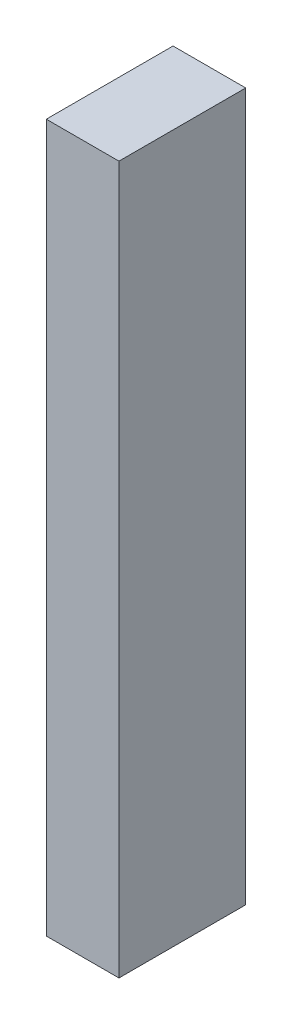
ISO-10303-21;
HEADER;
FILE_DESCRIPTION(('STEP AP214'),'2;1');
FILE_NAME('part.step','',(''),(''),'','','');
FILE_SCHEMA(('AUTOMOTIVE_DESIGN { 1 0 10303 214 1 1 1 1 }'));
ENDSEC;
DATA;
#1=APPLICATION_CONTEXT('core data for automotive mechanical design processes');
#2=APPLICATION_PROTOCOL_DEFINITION('international standard','automotive_design',2000,#1);
#3=PRODUCT_CONTEXT('',#1,'mechanical');
#4=PRODUCT('Part','Part','',(#3));
#5=PRODUCT_RELATED_PRODUCT_CATEGORY('part','',(#4));
#6=PRODUCT_DEFINITION_FORMATION('','',#4);
#7=PRODUCT_DEFINITION_CONTEXT('part definition',#1,'design');
#8=PRODUCT_DEFINITION('design','',#6,#7);
#9=PRODUCT_DEFINITION_SHAPE('','',#8);
#10=(LENGTH_UNIT() NAMED_UNIT(*) SI_UNIT(.MILLI.,.METRE.));
#11=(NAMED_UNIT(*) PLANE_ANGLE_UNIT() SI_UNIT($,.RADIAN.));
#12=(NAMED_UNIT(*) SI_UNIT($,.STERADIAN.) SOLID_ANGLE_UNIT());
#13=UNCERTAINTY_MEASURE_WITH_UNIT(LENGTH_MEASURE(1.E-05),#10,'distance_accuracy_value','');
#14=(GEOMETRIC_REPRESENTATION_CONTEXT(3) GLOBAL_UNCERTAINTY_ASSIGNED_CONTEXT((#13)) GLOBAL_UNIT_ASSIGNED_CONTEXT((#10,
#11,#12)) REPRESENTATION_CONTEXT('',''));
#15=CARTESIAN_POINT('',(0.,0.,0.));
#16=DIRECTION('',(0.,0.,1.));
#17=DIRECTION('',(1.,0.,0.));
#18=AXIS2_PLACEMENT_3D('',#15,#16,#17);
#19=CARTESIAN_POINT('',(-2.465,24.,8.6));
#20=DIRECTION('',(1.,0.,0.));
#21=DIRECTION('',(0.,1.,0.));
#22=AXIS2_PLACEMENT_3D('',#19,#20,#21);
#23=PLANE('',#22);
#24=DIRECTION('',(0.,-1.,0.));
#25=VECTOR('',#24,1.);
#26=CARTESIAN_POINT('',(-2.465,24.,0.));
#27=LINE('',#26,#25);
#28=CARTESIAN_POINT('',(-2.465,24.,0.));
#29=VERTEX_POINT('',#28);
#30=CARTESIAN_POINT('',(-2.465,-24.,0.));
#31=VERTEX_POINT('',#30);
#32=EDGE_CURVE('E95',#29,#31,#27,.T.);
#33=ORIENTED_EDGE('',*,*,#32,.T.);
#34=DIRECTION('',(0.,0.,-1.));
#35=VECTOR('',#34,1.);
#36=CARTESIAN_POINT('',(-2.465,-24.,8.6));
#37=LINE('',#36,#35);
#38=CARTESIAN_POINT('',(-2.465,-24.,8.6));
#39=VERTEX_POINT('',#38);
#40=EDGE_CURVE('E11',#39,#31,#37,.T.);
#41=ORIENTED_EDGE('',*,*,#40,.F.);
#42=DIRECTION('',(0.,-1.,0.));
#43=VECTOR('',#42,1.);
#44=CARTESIAN_POINT('',(-2.465,24.,8.6));
#45=LINE('',#44,#43);
#46=CARTESIAN_POINT('',(-2.465,24.,8.6));
#47=VERTEX_POINT('',#46);
#48=EDGE_CURVE('E83',#47,#39,#45,.T.);
#49=ORIENTED_EDGE('',*,*,#48,.F.);
#50=DIRECTION('',(0.,0.,-1.));
#51=VECTOR('',#50,1.);
#52=CARTESIAN_POINT('',(-2.465,24.,8.6));
#53=LINE('',#52,#51);
#54=EDGE_CURVE('E91',#47,#29,#53,.T.);
#55=ORIENTED_EDGE('',*,*,#54,.T.);
#56=EDGE_LOOP('',(#33,#41,#49,#55));
#57=FACE_BOUND('',#56,.T.);
#58=ADVANCED_FACE('F32',(#57),#23,.F.);
#59=CARTESIAN_POINT('',(2.465,-24.,8.6));
#60=DIRECTION('',(0.,1.,0.));
#61=DIRECTION('',(0.,0.,1.));
#62=AXIS2_PLACEMENT_3D('',#59,#60,#61);
#63=PLANE('',#62);
#64=DIRECTION('',(1.,0.,0.));
#65=VECTOR('',#64,1.);
#66=CARTESIAN_POINT('',(2.465,-24.,0.));
#67=LINE('',#66,#65);
#68=CARTESIAN_POINT('',(2.465,-24.,0.));
#69=VERTEX_POINT('',#68);
#70=EDGE_CURVE('E87',#31,#69,#67,.T.);
#71=ORIENTED_EDGE('',*,*,#70,.T.);
#72=DIRECTION('',(0.,0.,-1.));
#73=VECTOR('',#72,1.);
#74=CARTESIAN_POINT('',(2.465,-24.,8.6));
#75=LINE('',#74,#73);
#76=CARTESIAN_POINT('',(2.465,-24.,8.6));
#77=VERTEX_POINT('',#76);
#78=EDGE_CURVE('E40',#77,#69,#75,.T.);
#79=ORIENTED_EDGE('',*,*,#78,.F.);
#80=DIRECTION('',(1.,0.,0.));
#81=VECTOR('',#80,1.);
#82=CARTESIAN_POINT('',(2.465,-24.,8.6));
#83=LINE('',#82,#81);
#84=EDGE_CURVE('E78',#39,#77,#83,.T.);
#85=ORIENTED_EDGE('',*,*,#84,.F.);
#86=ORIENTED_EDGE('',*,*,#40,.T.);
#87=EDGE_LOOP('',(#71,#79,#85,#86));
#88=FACE_BOUND('',#87,.T.);
#89=ADVANCED_FACE('F86',(#88),#63,.F.);
#90=CARTESIAN_POINT('',(2.465,24.,8.6));
#91=DIRECTION('',(-1.,0.,0.));
#92=DIRECTION('',(0.,-1.,0.));
#93=AXIS2_PLACEMENT_3D('',#90,#91,#92);
#94=PLANE('',#93);
#95=DIRECTION('',(0.,1.,0.));
#96=VECTOR('',#95,1.);
#97=CARTESIAN_POINT('',(2.465,24.,0.));
#98=LINE('',#97,#96);
#99=CARTESIAN_POINT('',(2.465,24.,0.));
#100=VERTEX_POINT('',#99);
#101=EDGE_CURVE('E65',#69,#100,#98,.T.);
#102=ORIENTED_EDGE('',*,*,#101,.T.);
#103=DIRECTION('',(0.,0.,-1.));
#104=VECTOR('',#103,1.);
#105=CARTESIAN_POINT('',(2.465,24.,8.6));
#106=LINE('',#105,#104);
#107=CARTESIAN_POINT('',(2.465,24.,8.6));
#108=VERTEX_POINT('',#107);
#109=EDGE_CURVE('E88',#108,#100,#106,.T.);
#110=ORIENTED_EDGE('',*,*,#109,.F.);
#111=DIRECTION('',(0.,1.,0.));
#112=VECTOR('',#111,1.);
#113=CARTESIAN_POINT('',(2.465,24.,8.6));
#114=LINE('',#113,#112);
#115=EDGE_CURVE('E81',#77,#108,#114,.T.);
#116=ORIENTED_EDGE('',*,*,#115,.F.);
#117=ORIENTED_EDGE('',*,*,#78,.T.);
#118=EDGE_LOOP('',(#102,#110,#116,#117));
#119=FACE_BOUND('',#118,.T.);
#120=ADVANCED_FACE('F89',(#119),#94,.F.);
#121=CARTESIAN_POINT('',(2.465,24.,8.6));
#122=DIRECTION('',(0.,-1.,0.));
#123=DIRECTION('',(0.,0.,-1.));
#124=AXIS2_PLACEMENT_3D('',#121,#122,#123);
#125=PLANE('',#124);
#126=DIRECTION('',(-1.,0.,0.));
#127=VECTOR('',#126,1.);
#128=CARTESIAN_POINT('',(2.465,24.,0.));
#129=LINE('',#128,#127);
#130=EDGE_CURVE('E71',#100,#29,#129,.T.);
#131=ORIENTED_EDGE('',*,*,#130,.T.);
#132=ORIENTED_EDGE('',*,*,#54,.F.);
#133=DIRECTION('',(-1.,0.,0.));
#134=VECTOR('',#133,1.);
#135=CARTESIAN_POINT('',(2.465,24.,8.6));
#136=LINE('',#135,#134);
#137=EDGE_CURVE('E48',#108,#47,#136,.T.);
#138=ORIENTED_EDGE('',*,*,#137,.F.);
#139=ORIENTED_EDGE('',*,*,#109,.T.);
#140=EDGE_LOOP('',(#131,#132,#138,#139));
#141=FACE_BOUND('',#140,.T.);
#142=ADVANCED_FACE('F102',(#141),#125,.F.);
#143=CARTESIAN_POINT('',(0.,0.,8.6));
#144=DIRECTION('',(0.,0.,-1.));
#145=DIRECTION('',(-1.,0.,0.));
#146=AXIS2_PLACEMENT_3D('',#143,#144,#145);
#147=PLANE('',#146);
#148=ORIENTED_EDGE('',*,*,#48,.T.);
#149=ORIENTED_EDGE('',*,*,#84,.T.);
#150=ORIENTED_EDGE('',*,*,#115,.T.);
#151=ORIENTED_EDGE('',*,*,#137,.T.);
#152=EDGE_LOOP('',(#148,#149,#150,#151));
#153=FACE_BOUND('',#152,.T.);
#154=ADVANCED_FACE('F79',(#153),#147,.F.);
#155=CARTESIAN_POINT('',(0.,0.,0.));
#156=DIRECTION('',(0.,0.,-1.));
#157=DIRECTION('',(-1.,0.,0.));
#158=AXIS2_PLACEMENT_3D('',#155,#156,#157);
#159=PLANE('',#158);
#160=ORIENTED_EDGE('',*,*,#32,.F.);
#161=ORIENTED_EDGE('',*,*,#130,.F.);
#162=ORIENTED_EDGE('',*,*,#101,.F.);
#163=ORIENTED_EDGE('',*,*,#70,.F.);
#164=EDGE_LOOP('',(#160,#161,#162,#163));
#165=FACE_BOUND('',#164,.T.);
#166=ADVANCED_FACE('F105',(#165),#159,.T.);
#167=CLOSED_SHELL('',(#58,#89,#120,#142,#154,#166));
#168=MANIFOLD_SOLID_BREP('B2',#167);
#169=ADVANCED_BREP_SHAPE_REPRESENTATION('',(#18,#168),#14);
#170=SHAPE_DEFINITION_REPRESENTATION(#9,#169);
ENDSEC;
END-ISO-10303-21;
